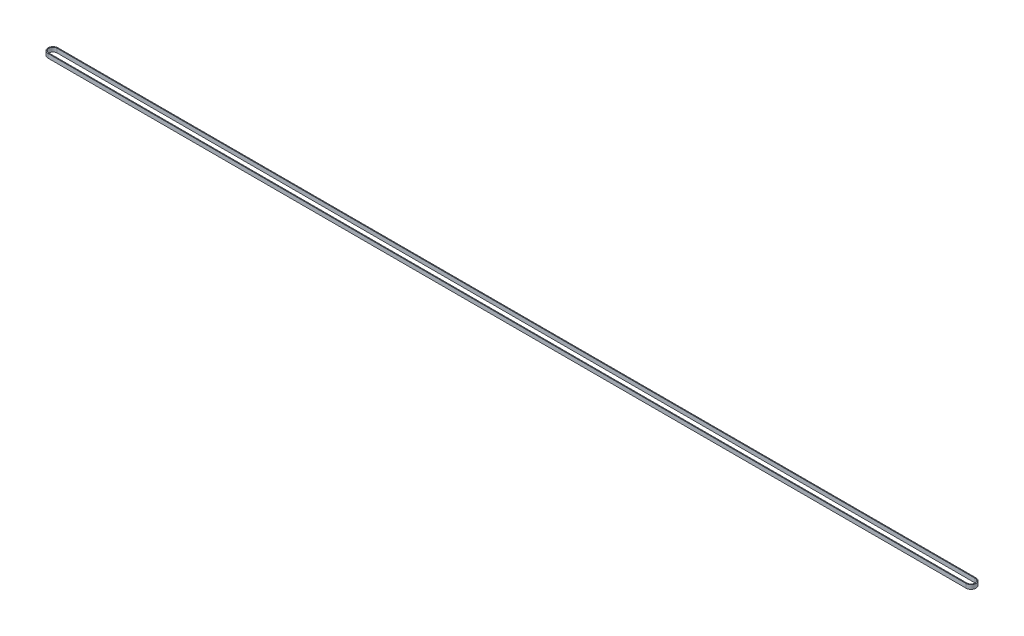
ISO-10303-21;
HEADER;
FILE_DESCRIPTION(('STEP AP214'),'2;1');
FILE_NAME('part.step','',(''),(''),'','','');
FILE_SCHEMA(('AUTOMOTIVE_DESIGN { 1 0 10303 214 1 1 1 1 }'));
ENDSEC;
DATA;
#1=APPLICATION_CONTEXT('core data for automotive mechanical design processes');
#2=APPLICATION_PROTOCOL_DEFINITION('international standard','automotive_design',2000,#1);
#3=PRODUCT_CONTEXT('',#1,'mechanical');
#4=PRODUCT('Part','Part','',(#3));
#5=PRODUCT_RELATED_PRODUCT_CATEGORY('part','',(#4));
#6=PRODUCT_DEFINITION_FORMATION('','',#4);
#7=PRODUCT_DEFINITION_CONTEXT('part definition',#1,'design');
#8=PRODUCT_DEFINITION('design','',#6,#7);
#9=PRODUCT_DEFINITION_SHAPE('','',#8);
#10=(LENGTH_UNIT() NAMED_UNIT(*) SI_UNIT(.MILLI.,.METRE.));
#11=(NAMED_UNIT(*) PLANE_ANGLE_UNIT() SI_UNIT($,.RADIAN.));
#12=(NAMED_UNIT(*) SI_UNIT($,.STERADIAN.) SOLID_ANGLE_UNIT());
#13=UNCERTAINTY_MEASURE_WITH_UNIT(LENGTH_MEASURE(1.E-05),#10,'distance_accuracy_value','');
#14=(GEOMETRIC_REPRESENTATION_CONTEXT(3) GLOBAL_UNCERTAINTY_ASSIGNED_CONTEXT((#13)) GLOBAL_UNIT_ASSIGNED_CONTEXT((#10,
#11,#12)) REPRESENTATION_CONTEXT('',''));
#15=CARTESIAN_POINT('',(0.,0.,0.));
#16=DIRECTION('',(0.,0.,1.));
#17=DIRECTION('',(1.,0.,0.));
#18=AXIS2_PLACEMENT_3D('',#15,#16,#17);
#19=CARTESIAN_POINT('',(-557.95,2.5,0.));
#20=DIRECTION('',(0.,1.,0.));
#21=DIRECTION('',(0.,0.,1.));
#22=AXIS2_PLACEMENT_3D('',#19,#20,#21);
#23=PLANE('',#22);
#24=CARTESIAN_POINT('',(-557.95,2.5,0.));
#25=DIRECTION('',(0.,1.,0.));
#26=DIRECTION('',(0.,0.,1.));
#27=AXIS2_PLACEMENT_3D('',#24,#25,#26);
#28=CIRCLE('',#27,6.);
#29=CARTESIAN_POINT('',(-557.95,2.5,-6.));
#30=VERTEX_POINT('',#29);
#31=CARTESIAN_POINT('',(-557.95,2.5,6.));
#32=VERTEX_POINT('',#31);
#33=EDGE_CURVE('E159',#30,#32,#28,.T.);
#34=ORIENTED_EDGE('',*,*,#33,.T.);
#35=DIRECTION('',(1.,0.,0.));
#36=VECTOR('',#35,1.);
#37=CARTESIAN_POINT('',(-557.95,2.5,6.));
#38=LINE('',#37,#36);
#39=CARTESIAN_POINT('',(557.95,2.5,5.99999999999969));
#40=VERTEX_POINT('',#39);
#41=EDGE_CURVE('E163',#32,#40,#38,.T.);
#42=ORIENTED_EDGE('',*,*,#41,.T.);
#43=CARTESIAN_POINT('',(557.95,2.5,-2.0498750447528E-13));
#44=DIRECTION('',(0.,1.,0.));
#45=DIRECTION('',(0.,0.,1.));
#46=AXIS2_PLACEMENT_3D('',#43,#44,#45);
#47=CIRCLE('',#46,5.9999999999999);
#48=CARTESIAN_POINT('',(557.95,2.5,-6.));
#49=VERTEX_POINT('',#48);
#50=EDGE_CURVE('E167',#40,#49,#47,.T.);
#51=ORIENTED_EDGE('',*,*,#50,.T.);
#52=DIRECTION('',(-1.,0.,0.));
#53=VECTOR('',#52,1.);
#54=CARTESIAN_POINT('',(-557.95,2.5,-6.));
#55=LINE('',#54,#53);
#56=EDGE_CURVE('E170',#49,#30,#55,.T.);
#57=ORIENTED_EDGE('',*,*,#56,.T.);
#58=EDGE_LOOP('',(#34,#42,#51,#57));
#59=FACE_BOUND('',#58,.T.);
#60=DIRECTION('',(1.,0.,0.));
#61=VECTOR('',#60,1.);
#62=CARTESIAN_POINT('',(-557.95,2.5,5.));
#63=LINE('',#62,#61);
#64=CARTESIAN_POINT('',(-557.95,2.5,5.));
#65=VERTEX_POINT('',#64);
#66=CARTESIAN_POINT('',(557.95,2.5,4.9999999999998));
#67=VERTEX_POINT('',#66);
#68=EDGE_CURVE('E120',#65,#67,#63,.T.);
#69=ORIENTED_EDGE('',*,*,#68,.F.);
#70=CARTESIAN_POINT('',(-557.95,2.5,0.));
#71=DIRECTION('',(0.,1.,0.));
#72=DIRECTION('',(0.,0.,1.));
#73=AXIS2_PLACEMENT_3D('',#70,#71,#72);
#74=CIRCLE('',#73,5.);
#75=CARTESIAN_POINT('',(-557.95,2.5,-5.));
#76=VERTEX_POINT('',#75);
#77=EDGE_CURVE('E111',#76,#65,#74,.T.);
#78=ORIENTED_EDGE('',*,*,#77,.F.);
#79=DIRECTION('',(-1.,0.,0.));
#80=VECTOR('',#79,1.);
#81=CARTESIAN_POINT('',(-557.95,2.5,-5.));
#82=LINE('',#81,#80);
#83=CARTESIAN_POINT('',(557.95,2.5,-5.00000000000021));
#84=VERTEX_POINT('',#83);
#85=EDGE_CURVE('E137',#84,#76,#82,.T.);
#86=ORIENTED_EDGE('',*,*,#85,.F.);
#87=CARTESIAN_POINT('',(557.95,2.5,-2.0498750447528E-13));
#88=DIRECTION('',(0.,1.,0.));
#89=DIRECTION('',(0.,0.,1.));
#90=AXIS2_PLACEMENT_3D('',#87,#88,#89);
#91=CIRCLE('',#90,5.);
#92=EDGE_CURVE('E133',#67,#84,#91,.T.);
#93=ORIENTED_EDGE('',*,*,#92,.F.);
#94=EDGE_LOOP('',(#69,#78,#86,#93));
#95=FACE_BOUND('',#94,.T.);
#96=ADVANCED_FACE('F45',(#59,#95),#23,.T.);
#97=CARTESIAN_POINT('',(-557.95,-2.5,0.));
#98=DIRECTION('',(0.,1.,0.));
#99=DIRECTION('',(0.,0.,1.));
#100=AXIS2_PLACEMENT_3D('',#97,#98,#99);
#101=PLANE('',#100);
#102=CARTESIAN_POINT('',(-557.95,-2.5,0.));
#103=DIRECTION('',(0.,1.,0.));
#104=DIRECTION('',(0.,0.,1.));
#105=AXIS2_PLACEMENT_3D('',#102,#103,#104);
#106=CIRCLE('',#105,6.);
#107=CARTESIAN_POINT('',(-557.95,-2.5,-6.));
#108=VERTEX_POINT('',#107);
#109=CARTESIAN_POINT('',(-557.95,-2.5,6.));
#110=VERTEX_POINT('',#109);
#111=EDGE_CURVE('E129',#108,#110,#106,.T.);
#112=ORIENTED_EDGE('',*,*,#111,.F.);
#113=DIRECTION('',(-1.,0.,0.));
#114=VECTOR('',#113,1.);
#115=CARTESIAN_POINT('',(-557.95,-2.5,-6.));
#116=LINE('',#115,#114);
#117=CARTESIAN_POINT('',(557.95,-2.5,-6.));
#118=VERTEX_POINT('',#117);
#119=EDGE_CURVE('E164',#118,#108,#116,.T.);
#120=ORIENTED_EDGE('',*,*,#119,.F.);
#121=CARTESIAN_POINT('',(557.95,-2.5,-2.0498750447528E-13));
#122=DIRECTION('',(0.,1.,0.));
#123=DIRECTION('',(0.,0.,1.));
#124=AXIS2_PLACEMENT_3D('',#121,#122,#123);
#125=CIRCLE('',#124,5.9999999999999);
#126=CARTESIAN_POINT('',(557.95,-2.5,5.99999999999969));
#127=VERTEX_POINT('',#126);
#128=EDGE_CURVE('E180',#127,#118,#125,.T.);
#129=ORIENTED_EDGE('',*,*,#128,.F.);
#130=DIRECTION('',(1.,0.,0.));
#131=VECTOR('',#130,1.);
#132=CARTESIAN_POINT('',(-557.95,-2.5,6.));
#133=LINE('',#132,#131);
#134=EDGE_CURVE('E177',#110,#127,#133,.T.);
#135=ORIENTED_EDGE('',*,*,#134,.F.);
#136=EDGE_LOOP('',(#112,#120,#129,#135));
#137=FACE_BOUND('',#136,.T.);
#138=CARTESIAN_POINT('',(-557.95,-2.5,0.));
#139=DIRECTION('',(0.,1.,0.));
#140=DIRECTION('',(0.,0.,1.));
#141=AXIS2_PLACEMENT_3D('',#138,#139,#140);
#142=CIRCLE('',#141,5.);
#143=CARTESIAN_POINT('',(-557.95,-2.5,-5.));
#144=VERTEX_POINT('',#143);
#145=CARTESIAN_POINT('',(-557.95,-2.5,5.));
#146=VERTEX_POINT('',#145);
#147=EDGE_CURVE('E69',#144,#146,#142,.T.);
#148=ORIENTED_EDGE('',*,*,#147,.T.);
#149=DIRECTION('',(1.,0.,0.));
#150=VECTOR('',#149,1.);
#151=CARTESIAN_POINT('',(-557.95,-2.5,5.));
#152=LINE('',#151,#150);
#153=CARTESIAN_POINT('',(557.95,-2.5,4.9999999999998));
#154=VERTEX_POINT('',#153);
#155=EDGE_CURVE('E127',#146,#154,#152,.T.);
#156=ORIENTED_EDGE('',*,*,#155,.T.);
#157=CARTESIAN_POINT('',(557.95,-2.5,-2.0498750447528E-13));
#158=DIRECTION('',(0.,1.,0.));
#159=DIRECTION('',(0.,0.,1.));
#160=AXIS2_PLACEMENT_3D('',#157,#158,#159);
#161=CIRCLE('',#160,5.);
#162=CARTESIAN_POINT('',(557.95,-2.5,-5.00000000000021));
#163=VERTEX_POINT('',#162);
#164=EDGE_CURVE('E146',#154,#163,#161,.T.);
#165=ORIENTED_EDGE('',*,*,#164,.T.);
#166=DIRECTION('',(-1.,0.,0.));
#167=VECTOR('',#166,1.);
#168=CARTESIAN_POINT('',(-557.95,-2.5,-5.));
#169=LINE('',#168,#167);
#170=EDGE_CURVE('E121',#163,#144,#169,.T.);
#171=ORIENTED_EDGE('',*,*,#170,.T.);
#172=EDGE_LOOP('',(#148,#156,#165,#171));
#173=FACE_BOUND('',#172,.T.);
#174=ADVANCED_FACE('F203',(#137,#173),#101,.F.);
#175=CARTESIAN_POINT('',(-557.95,2.5,0.));
#176=DIRECTION('',(0.,-1.,0.));
#177=DIRECTION('',(0.,0.,-1.));
#178=AXIS2_PLACEMENT_3D('',#175,#176,#177);
#179=CYLINDRICAL_SURFACE('',#178,6.);
#180=ORIENTED_EDGE('',*,*,#111,.T.);
#181=DIRECTION('',(0.,-1.,0.));
#182=VECTOR('',#181,1.);
#183=CARTESIAN_POINT('',(-557.95,2.5,6.));
#184=LINE('',#183,#182);
#185=EDGE_CURVE('E11',#32,#110,#184,.T.);
#186=ORIENTED_EDGE('',*,*,#185,.F.);
#187=ORIENTED_EDGE('',*,*,#33,.F.);
#188=DIRECTION('',(0.,-1.,0.));
#189=VECTOR('',#188,1.);
#190=CARTESIAN_POINT('',(-557.95,2.5,-6.));
#191=LINE('',#190,#189);
#192=EDGE_CURVE('E173',#30,#108,#191,.T.);
#193=ORIENTED_EDGE('',*,*,#192,.T.);
#194=EDGE_LOOP('',(#180,#186,#187,#193));
#195=FACE_BOUND('',#194,.T.);
#196=ADVANCED_FACE('F47',(#195),#179,.T.);
#197=CARTESIAN_POINT('',(-557.95,2.5,6.));
#198=DIRECTION('',(0.,0.,-1.));
#199=DIRECTION('',(-1.,0.,0.));
#200=AXIS2_PLACEMENT_3D('',#197,#198,#199);
#201=PLANE('',#200);
#202=ORIENTED_EDGE('',*,*,#134,.T.);
#203=DIRECTION('',(0.,-1.,0.));
#204=VECTOR('',#203,1.);
#205=CARTESIAN_POINT('',(557.95,2.5,5.99999999999969));
#206=LINE('',#205,#204);
#207=EDGE_CURVE('E54',#40,#127,#206,.T.);
#208=ORIENTED_EDGE('',*,*,#207,.F.);
#209=ORIENTED_EDGE('',*,*,#41,.F.);
#210=ORIENTED_EDGE('',*,*,#185,.T.);
#211=EDGE_LOOP('',(#202,#208,#209,#210));
#212=FACE_BOUND('',#211,.T.);
#213=ADVANCED_FACE('F213',(#212),#201,.F.);
#214=CARTESIAN_POINT('',(557.95,2.5,-2.0498750447528E-13));
#215=DIRECTION('',(0.,-1.,0.));
#216=DIRECTION('',(0.,0.,-1.));
#217=AXIS2_PLACEMENT_3D('',#214,#215,#216);
#218=CYLINDRICAL_SURFACE('',#217,5.9999999999999);
#219=ORIENTED_EDGE('',*,*,#128,.T.);
#220=DIRECTION('',(0.,-1.,0.));
#221=VECTOR('',#220,1.);
#222=CARTESIAN_POINT('',(557.95,2.5,-6.));
#223=LINE('',#222,#221);
#224=EDGE_CURVE('E188',#49,#118,#223,.T.);
#225=ORIENTED_EDGE('',*,*,#224,.F.);
#226=ORIENTED_EDGE('',*,*,#50,.F.);
#227=ORIENTED_EDGE('',*,*,#207,.T.);
#228=EDGE_LOOP('',(#219,#225,#226,#227));
#229=FACE_BOUND('',#228,.T.);
#230=ADVANCED_FACE('F197',(#229),#218,.T.);
#231=CARTESIAN_POINT('',(-557.95,2.5,-6.));
#232=DIRECTION('',(0.,0.,1.));
#233=DIRECTION('',(1.,0.,0.));
#234=AXIS2_PLACEMENT_3D('',#231,#232,#233);
#235=PLANE('',#234);
#236=ORIENTED_EDGE('',*,*,#119,.T.);
#237=ORIENTED_EDGE('',*,*,#192,.F.);
#238=ORIENTED_EDGE('',*,*,#56,.F.);
#239=ORIENTED_EDGE('',*,*,#224,.T.);
#240=EDGE_LOOP('',(#236,#237,#238,#239));
#241=FACE_BOUND('',#240,.T.);
#242=ADVANCED_FACE('F207',(#241),#235,.F.);
#243=CARTESIAN_POINT('',(-557.95,2.5,0.));
#244=DIRECTION('',(0.,-1.,0.));
#245=DIRECTION('',(0.,0.,-1.));
#246=AXIS2_PLACEMENT_3D('',#243,#244,#245);
#247=CYLINDRICAL_SURFACE('',#246,5.);
#248=ORIENTED_EDGE('',*,*,#147,.F.);
#249=DIRECTION('',(0.,-1.,0.));
#250=VECTOR('',#249,1.);
#251=CARTESIAN_POINT('',(-557.95,2.5,-5.));
#252=LINE('',#251,#250);
#253=EDGE_CURVE('E115',#76,#144,#252,.T.);
#254=ORIENTED_EDGE('',*,*,#253,.F.);
#255=ORIENTED_EDGE('',*,*,#77,.T.);
#256=DIRECTION('',(0.,-1.,0.));
#257=VECTOR('',#256,1.);
#258=CARTESIAN_POINT('',(-557.95,2.5,5.));
#259=LINE('',#258,#257);
#260=EDGE_CURVE('E114',#65,#146,#259,.T.);
#261=ORIENTED_EDGE('',*,*,#260,.T.);
#262=EDGE_LOOP('',(#248,#254,#255,#261));
#263=FACE_BOUND('',#262,.T.);
#264=ADVANCED_FACE('F113',(#263),#247,.F.);
#265=CARTESIAN_POINT('',(-557.95,2.5,5.));
#266=DIRECTION('',(0.,0.,-1.));
#267=DIRECTION('',(-1.,0.,0.));
#268=AXIS2_PLACEMENT_3D('',#265,#266,#267);
#269=PLANE('',#268);
#270=ORIENTED_EDGE('',*,*,#155,.F.);
#271=ORIENTED_EDGE('',*,*,#260,.F.);
#272=ORIENTED_EDGE('',*,*,#68,.T.);
#273=DIRECTION('',(0.,-1.,0.));
#274=VECTOR('',#273,1.);
#275=CARTESIAN_POINT('',(557.95,2.5,4.9999999999998));
#276=LINE('',#275,#274);
#277=EDGE_CURVE('E130',#67,#154,#276,.T.);
#278=ORIENTED_EDGE('',*,*,#277,.T.);
#279=EDGE_LOOP('',(#270,#271,#272,#278));
#280=FACE_BOUND('',#279,.T.);
#281=ADVANCED_FACE('F124',(#280),#269,.T.);
#282=CARTESIAN_POINT('',(557.95,2.5,-2.0498750447528E-13));
#283=DIRECTION('',(0.,-1.,0.));
#284=DIRECTION('',(0.,0.,-1.));
#285=AXIS2_PLACEMENT_3D('',#282,#283,#284);
#286=CYLINDRICAL_SURFACE('',#285,5.);
#287=ORIENTED_EDGE('',*,*,#164,.F.);
#288=ORIENTED_EDGE('',*,*,#277,.F.);
#289=ORIENTED_EDGE('',*,*,#92,.T.);
#290=DIRECTION('',(0.,-1.,0.));
#291=VECTOR('',#290,1.);
#292=CARTESIAN_POINT('',(557.95,2.5,-5.00000000000021));
#293=LINE('',#292,#291);
#294=EDGE_CURVE('E61',#84,#163,#293,.T.);
#295=ORIENTED_EDGE('',*,*,#294,.T.);
#296=EDGE_LOOP('',(#287,#288,#289,#295));
#297=FACE_BOUND('',#296,.T.);
#298=ADVANCED_FACE('F236',(#297),#286,.F.);
#299=CARTESIAN_POINT('',(-557.95,2.5,-5.));
#300=DIRECTION('',(0.,0.,1.));
#301=DIRECTION('',(1.,0.,0.));
#302=AXIS2_PLACEMENT_3D('',#299,#300,#301);
#303=PLANE('',#302);
#304=ORIENTED_EDGE('',*,*,#170,.F.);
#305=ORIENTED_EDGE('',*,*,#294,.F.);
#306=ORIENTED_EDGE('',*,*,#85,.T.);
#307=ORIENTED_EDGE('',*,*,#253,.T.);
#308=EDGE_LOOP('',(#304,#305,#306,#307));
#309=FACE_BOUND('',#308,.T.);
#310=ADVANCED_FACE('F240',(#309),#303,.T.);
#311=CLOSED_SHELL('',(#96,#174,#196,#213,#230,#242,#264,#281,#298,#310));
#312=MANIFOLD_SOLID_BREP('B2',#311);
#313=ADVANCED_BREP_SHAPE_REPRESENTATION('',(#18,#312),#14);
#314=SHAPE_DEFINITION_REPRESENTATION(#9,#313);
ENDSEC;
END-ISO-10303-21;
